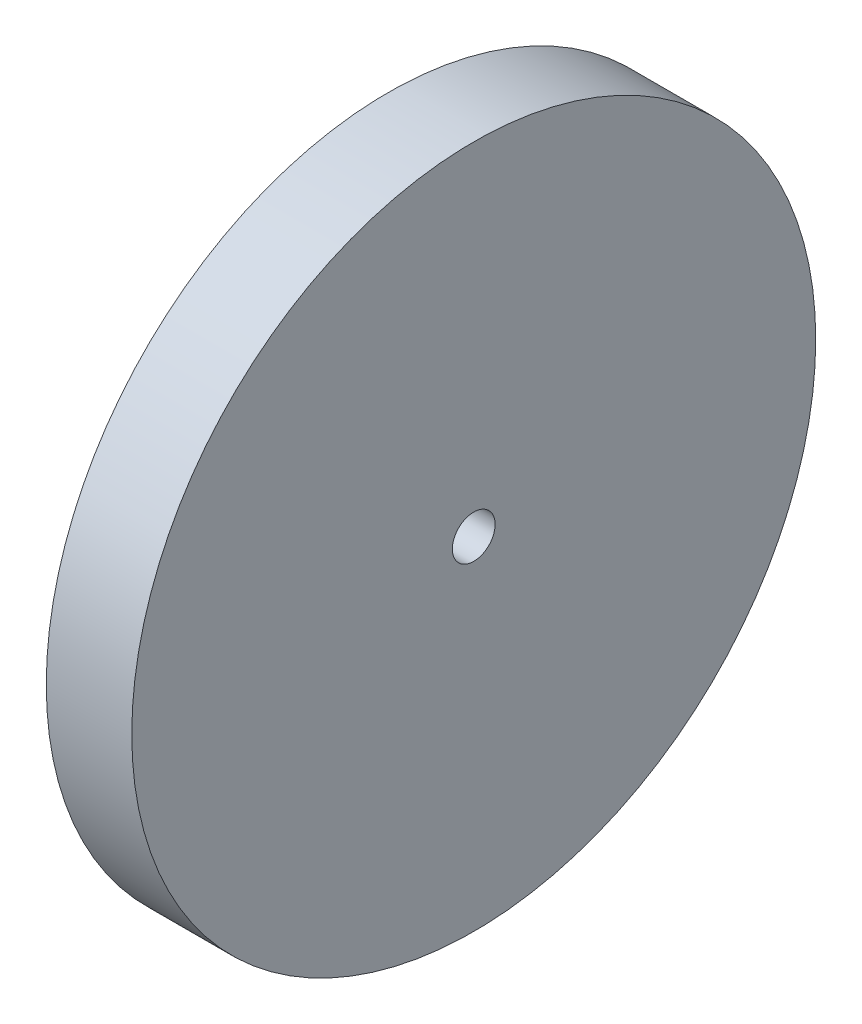
ISO-10303-21;
HEADER;
FILE_DESCRIPTION(('STEP AP214'),'2;1');
FILE_NAME('part.step','',(''),(''),'','','');
FILE_SCHEMA(('AUTOMOTIVE_DESIGN { 1 0 10303 214 1 1 1 1 }'));
ENDSEC;
DATA;
#1=APPLICATION_CONTEXT('core data for automotive mechanical design processes');
#2=APPLICATION_PROTOCOL_DEFINITION('international standard','automotive_design',2000,#1);
#3=PRODUCT_CONTEXT('',#1,'mechanical');
#4=PRODUCT('Part','Part','',(#3));
#5=PRODUCT_RELATED_PRODUCT_CATEGORY('part','',(#4));
#6=PRODUCT_DEFINITION_FORMATION('','',#4);
#7=PRODUCT_DEFINITION_CONTEXT('part definition',#1,'design');
#8=PRODUCT_DEFINITION('design','',#6,#7);
#9=PRODUCT_DEFINITION_SHAPE('','',#8);
#10=(LENGTH_UNIT() NAMED_UNIT(*) SI_UNIT(.MILLI.,.METRE.));
#11=(NAMED_UNIT(*) PLANE_ANGLE_UNIT() SI_UNIT($,.RADIAN.));
#12=(NAMED_UNIT(*) SI_UNIT($,.STERADIAN.) SOLID_ANGLE_UNIT());
#13=UNCERTAINTY_MEASURE_WITH_UNIT(LENGTH_MEASURE(1.E-05),#10,'distance_accuracy_value','');
#14=(GEOMETRIC_REPRESENTATION_CONTEXT(3) GLOBAL_UNCERTAINTY_ASSIGNED_CONTEXT((#13)) GLOBAL_UNIT_ASSIGNED_CONTEXT((#10,
#11,#12)) REPRESENTATION_CONTEXT('',''));
#15=CARTESIAN_POINT('',(0.,0.,0.));
#16=DIRECTION('',(0.,0.,1.));
#17=DIRECTION('',(1.,0.,0.));
#18=AXIS2_PLACEMENT_3D('',#15,#16,#17);
#19=CARTESIAN_POINT('',(20.,0.,0.));
#20=DIRECTION('',(1.,0.,0.));
#21=DIRECTION('',(0.,0.,-1.));
#22=AXIS2_PLACEMENT_3D('',#19,#20,#21);
#23=PLANE('',#22);
#24=CARTESIAN_POINT('',(20.,0.,0.));
#25=DIRECTION('',(1.,0.,0.));
#26=DIRECTION('',(0.,0.,-1.));
#27=AXIS2_PLACEMENT_3D('',#24,#25,#26);
#28=CIRCLE('',#27,80.);
#29=CARTESIAN_POINT('',(20.,0.,-80.));
#30=VERTEX_POINT('',#29);
#31=EDGE_CURVE('E10',#30,#30,#28,.T.);
#32=ORIENTED_EDGE('',*,*,#31,.T.);
#33=EDGE_LOOP('',(#32));
#34=FACE_BOUND('',#33,.T.);
#35=CARTESIAN_POINT('',(20.,0.,0.));
#36=DIRECTION('',(1.,0.,0.));
#37=DIRECTION('',(0.,0.,-1.));
#38=AXIS2_PLACEMENT_3D('',#35,#36,#37);
#39=CIRCLE('',#38,5.);
#40=CARTESIAN_POINT('',(20.,0.,-5.));
#41=VERTEX_POINT('',#40);
#42=EDGE_CURVE('E43',#41,#41,#39,.T.);
#43=ORIENTED_EDGE('',*,*,#42,.F.);
#44=EDGE_LOOP('',(#43));
#45=FACE_BOUND('',#44,.T.);
#46=ADVANCED_FACE('F32',(#34,#45),#23,.T.);
#47=CARTESIAN_POINT('',(0.,0.,0.));
#48=DIRECTION('',(1.,0.,0.));
#49=DIRECTION('',(0.,0.,-1.));
#50=AXIS2_PLACEMENT_3D('',#47,#48,#49);
#51=PLANE('',#50);
#52=CARTESIAN_POINT('',(0.,0.,0.));
#53=DIRECTION('',(1.,0.,0.));
#54=DIRECTION('',(0.,0.,-1.));
#55=AXIS2_PLACEMENT_3D('',#52,#53,#54);
#56=CIRCLE('',#55,80.);
#57=CARTESIAN_POINT('',(0.,0.,-80.));
#58=VERTEX_POINT('',#57);
#59=EDGE_CURVE('E36',#58,#58,#56,.T.);
#60=ORIENTED_EDGE('',*,*,#59,.F.);
#61=EDGE_LOOP('',(#60));
#62=FACE_BOUND('',#61,.T.);
#63=CARTESIAN_POINT('',(0.,0.,0.));
#64=DIRECTION('',(1.,0.,0.));
#65=DIRECTION('',(0.,0.,-1.));
#66=AXIS2_PLACEMENT_3D('',#63,#64,#65);
#67=CIRCLE('',#66,5.);
#68=CARTESIAN_POINT('',(0.,0.,-5.));
#69=VERTEX_POINT('',#68);
#70=EDGE_CURVE('E45',#69,#69,#67,.T.);
#71=ORIENTED_EDGE('',*,*,#70,.T.);
#72=EDGE_LOOP('',(#71));
#73=FACE_BOUND('',#72,.T.);
#74=ADVANCED_FACE('F55',(#62,#73),#51,.F.);
#75=CARTESIAN_POINT('',(20.,0.,0.));
#76=DIRECTION('',(-1.,0.,0.));
#77=DIRECTION('',(0.,0.,1.));
#78=AXIS2_PLACEMENT_3D('',#75,#76,#77);
#79=CYLINDRICAL_SURFACE('',#78,80.);
#80=ORIENTED_EDGE('',*,*,#31,.F.);
#81=EDGE_LOOP('',(#80));
#82=FACE_BOUND('',#81,.T.);
#83=ORIENTED_EDGE('',*,*,#59,.T.);
#84=EDGE_LOOP('',(#83));
#85=FACE_BOUND('',#84,.T.);
#86=ADVANCED_FACE('F34',(#82,#85),#79,.T.);
#87=CARTESIAN_POINT('',(20.,0.,0.));
#88=DIRECTION('',(-1.,0.,0.));
#89=DIRECTION('',(0.,0.,1.));
#90=AXIS2_PLACEMENT_3D('',#87,#88,#89);
#91=CYLINDRICAL_SURFACE('',#90,5.);
#92=ORIENTED_EDGE('',*,*,#42,.T.);
#93=EDGE_LOOP('',(#92));
#94=FACE_BOUND('',#93,.T.);
#95=ORIENTED_EDGE('',*,*,#70,.F.);
#96=EDGE_LOOP('',(#95));
#97=FACE_BOUND('',#96,.T.);
#98=ADVANCED_FACE('F51',(#94,#97),#91,.F.);
#99=CLOSED_SHELL('',(#46,#74,#86,#98));
#100=MANIFOLD_SOLID_BREP('B2',#99);
#101=ADVANCED_BREP_SHAPE_REPRESENTATION('',(#18,#100),#14);
#102=SHAPE_DEFINITION_REPRESENTATION(#9,#101);
ENDSEC;
END-ISO-10303-21;
